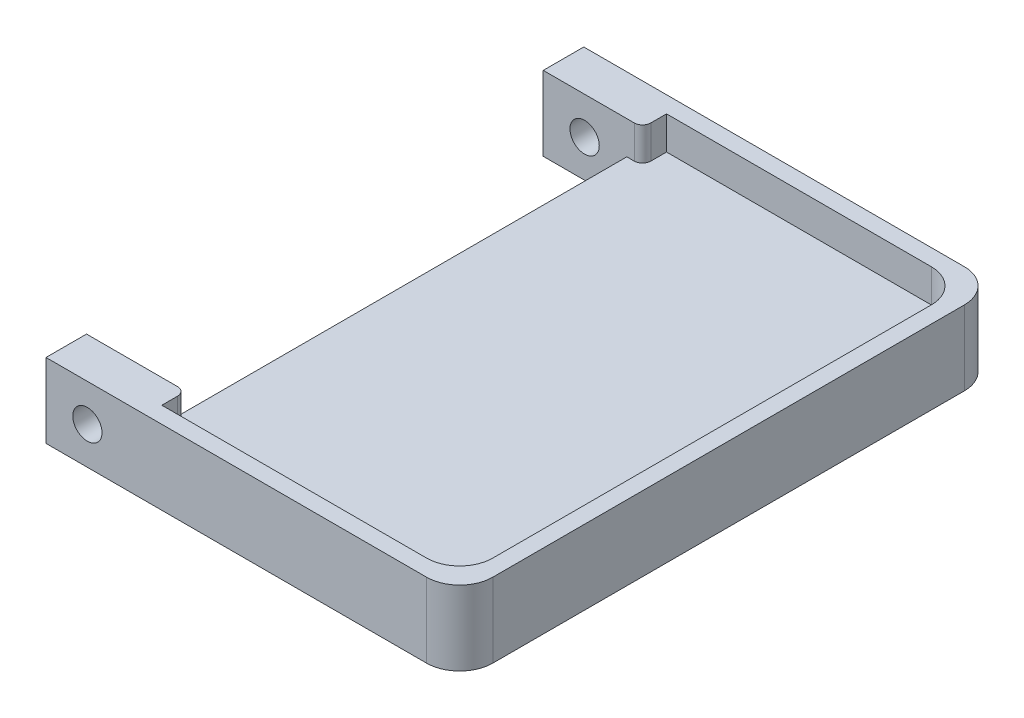
ISO-10303-21;
HEADER;
FILE_DESCRIPTION(('STEP AP214'),'2;1');
FILE_NAME('part.step','',(''),(''),'','','');
FILE_SCHEMA(('AUTOMOTIVE_DESIGN { 1 0 10303 214 1 1 1 1 }'));
ENDSEC;
DATA;
#1=APPLICATION_CONTEXT('core data for automotive mechanical design processes');
#2=APPLICATION_PROTOCOL_DEFINITION('international standard','automotive_design',2000,#1);
#3=PRODUCT_CONTEXT('',#1,'mechanical');
#4=PRODUCT('Part','Part','',(#3));
#5=PRODUCT_RELATED_PRODUCT_CATEGORY('part','',(#4));
#6=PRODUCT_DEFINITION_FORMATION('','',#4);
#7=PRODUCT_DEFINITION_CONTEXT('part definition',#1,'design');
#8=PRODUCT_DEFINITION('design','',#6,#7);
#9=PRODUCT_DEFINITION_SHAPE('','',#8);
#10=(LENGTH_UNIT() NAMED_UNIT(*) SI_UNIT(.MILLI.,.METRE.));
#11=(NAMED_UNIT(*) PLANE_ANGLE_UNIT() SI_UNIT($,.RADIAN.));
#12=(NAMED_UNIT(*) SI_UNIT($,.STERADIAN.) SOLID_ANGLE_UNIT());
#13=UNCERTAINTY_MEASURE_WITH_UNIT(LENGTH_MEASURE(1.E-05),#10,'distance_accuracy_value','');
#14=(GEOMETRIC_REPRESENTATION_CONTEXT(3) GLOBAL_UNCERTAINTY_ASSIGNED_CONTEXT((#13)) GLOBAL_UNIT_ASSIGNED_CONTEXT((#10,
#11,#12)) REPRESENTATION_CONTEXT('',''));
#15=CARTESIAN_POINT('',(0.,0.,0.));
#16=DIRECTION('',(0.,0.,1.));
#17=DIRECTION('',(1.,0.,0.));
#18=AXIS2_PLACEMENT_3D('',#15,#16,#17);
#19=CARTESIAN_POINT('',(0.,0.,6.223));
#20=DIRECTION('',(0.,0.,1.));
#21=DIRECTION('',(1.,0.,0.));
#22=AXIS2_PLACEMENT_3D('',#19,#20,#21);
#23=PLANE('',#22);
#24=CARTESIAN_POINT('',(6.35,5.715,6.223));
#25=DIRECTION('',(0.,0.,1.));
#26=DIRECTION('',(1.,0.,0.));
#27=AXIS2_PLACEMENT_3D('',#24,#25,#26);
#28=CIRCLE('',#27,2.2479);
#29=CARTESIAN_POINT('',(8.5979,5.715,6.223));
#30=VERTEX_POINT('',#29);
#31=EDGE_CURVE('E672',#30,#30,#28,.T.);
#32=ORIENTED_EDGE('',*,*,#31,.F.);
#33=EDGE_LOOP('',(#32));
#34=FACE_BOUND('',#33,.T.);
#35=DIRECTION('',(0.,-1.,0.));
#36=VECTOR('',#35,1.);
#37=CARTESIAN_POINT('',(12.827,6.35,6.223));
#38=LINE('',#37,#36);
#39=CARTESIAN_POINT('',(12.827,6.35,6.223));
#40=VERTEX_POINT('',#39);
#41=CARTESIAN_POINT('',(12.827,0.,6.223));
#42=VERTEX_POINT('',#41);
#43=EDGE_CURVE('E195',#40,#42,#38,.T.);
#44=ORIENTED_EDGE('',*,*,#43,.F.);
#45=DIRECTION('',(-1.,0.,0.));
#46=VECTOR('',#45,1.);
#47=CARTESIAN_POINT('',(13.335,6.35,6.223));
#48=LINE('',#47,#46);
#49=CARTESIAN_POINT('',(13.97,6.35,6.223));
#50=VERTEX_POINT('',#49);
#51=EDGE_CURVE('E222',#50,#40,#48,.T.);
#52=ORIENTED_EDGE('',*,*,#51,.F.);
#53=DIRECTION('',(0.,1.,0.));
#54=VECTOR('',#53,1.);
#55=CARTESIAN_POINT('',(13.97,11.43,6.223));
#56=LINE('',#55,#54);
#57=CARTESIAN_POINT('',(13.97,11.43,6.223));
#58=VERTEX_POINT('',#57);
#59=EDGE_CURVE('E369',#50,#58,#56,.T.);
#60=ORIENTED_EDGE('',*,*,#59,.T.);
#61=DIRECTION('',(1.,0.,0.));
#62=VECTOR('',#61,1.);
#63=CARTESIAN_POINT('',(0.,11.43,6.223));
#64=LINE('',#63,#62);
#65=CARTESIAN_POINT('',(0.,11.43,6.223));
#66=VERTEX_POINT('',#65);
#67=EDGE_CURVE('E214',#66,#58,#64,.T.);
#68=ORIENTED_EDGE('',*,*,#67,.F.);
#69=DIRECTION('',(0.,1.,0.));
#70=VECTOR('',#69,1.);
#71=CARTESIAN_POINT('',(0.,0.,6.223));
#72=LINE('',#71,#70);
#73=CARTESIAN_POINT('',(0.,0.,6.223));
#74=VERTEX_POINT('',#73);
#75=EDGE_CURVE('E207',#74,#66,#72,.T.);
#76=ORIENTED_EDGE('',*,*,#75,.F.);
#77=DIRECTION('',(1.,0.,0.));
#78=VECTOR('',#77,1.);
#79=CARTESIAN_POINT('',(0.,0.,6.223));
#80=LINE('',#79,#78);
#81=EDGE_CURVE('E189',#74,#42,#80,.T.);
#82=ORIENTED_EDGE('',*,*,#81,.T.);
#83=EDGE_LOOP('',(#44,#52,#60,#68,#76,#82));
#84=FACE_BOUND('',#83,.T.);
#85=ADVANCED_FACE('F45',(#34,#84),#23,.T.);
#86=CARTESIAN_POINT('',(0.,0.,76.327));
#87=DIRECTION('',(0.,0.,1.));
#88=DIRECTION('',(1.,0.,0.));
#89=AXIS2_PLACEMENT_3D('',#86,#87,#88);
#90=PLANE('',#89);
#91=CARTESIAN_POINT('',(6.35,5.715,76.327));
#92=DIRECTION('',(0.,0.,1.));
#93=DIRECTION('',(1.,0.,0.));
#94=AXIS2_PLACEMENT_3D('',#91,#92,#93);
#95=CIRCLE('',#94,2.2479);
#96=CARTESIAN_POINT('',(8.5979,5.715,76.327));
#97=VERTEX_POINT('',#96);
#98=EDGE_CURVE('E49',#97,#97,#95,.T.);
#99=ORIENTED_EDGE('',*,*,#98,.T.);
#100=EDGE_LOOP('',(#99));
#101=FACE_BOUND('',#100,.T.);
#102=DIRECTION('',(1.,0.,0.));
#103=VECTOR('',#102,1.);
#104=CARTESIAN_POINT('',(13.335,6.35,76.327));
#105=LINE('',#104,#103);
#106=CARTESIAN_POINT('',(12.827,6.35,76.327));
#107=VERTEX_POINT('',#106);
#108=CARTESIAN_POINT('',(13.97,6.35,76.327));
#109=VERTEX_POINT('',#108);
#110=EDGE_CURVE('E382',#107,#109,#105,.T.);
#111=ORIENTED_EDGE('',*,*,#110,.F.);
#112=DIRECTION('',(0.,1.,0.));
#113=VECTOR('',#112,1.);
#114=CARTESIAN_POINT('',(12.827,6.35,76.327));
#115=LINE('',#114,#113);
#116=CARTESIAN_POINT('',(12.827,0.,76.327));
#117=VERTEX_POINT('',#116);
#118=EDGE_CURVE('E194',#117,#107,#115,.T.);
#119=ORIENTED_EDGE('',*,*,#118,.F.);
#120=DIRECTION('',(1.,0.,0.));
#121=VECTOR('',#120,1.);
#122=CARTESIAN_POINT('',(0.,0.,76.327));
#123=LINE('',#122,#121);
#124=CARTESIAN_POINT('',(0.,0.,76.327));
#125=VERTEX_POINT('',#124);
#126=EDGE_CURVE('E192',#125,#117,#123,.T.);
#127=ORIENTED_EDGE('',*,*,#126,.F.);
#128=DIRECTION('',(0.,1.,0.));
#129=VECTOR('',#128,1.);
#130=CARTESIAN_POINT('',(0.,0.,76.327));
#131=LINE('',#130,#129);
#132=CARTESIAN_POINT('',(0.,11.43,76.327));
#133=VERTEX_POINT('',#132);
#134=EDGE_CURVE('E209',#125,#133,#131,.T.);
#135=ORIENTED_EDGE('',*,*,#134,.T.);
#136=DIRECTION('',(1.,0.,0.));
#137=VECTOR('',#136,1.);
#138=CARTESIAN_POINT('',(0.,11.43,76.327));
#139=LINE('',#138,#137);
#140=CARTESIAN_POINT('',(13.97,11.43,76.327));
#141=VERTEX_POINT('',#140);
#142=EDGE_CURVE('E218',#133,#141,#139,.T.);
#143=ORIENTED_EDGE('',*,*,#142,.T.);
#144=DIRECTION('',(0.,1.,0.));
#145=VECTOR('',#144,1.);
#146=CARTESIAN_POINT('',(13.97,0.,76.327));
#147=LINE('',#146,#145);
#148=EDGE_CURVE('E366',#141,#109,#147,.F.);
#149=ORIENTED_EDGE('',*,*,#148,.T.);
#150=EDGE_LOOP('',(#111,#119,#127,#135,#143,#149));
#151=FACE_BOUND('',#150,.T.);
#152=ADVANCED_FACE('F398',(#101,#151),#90,.F.);
#153=CARTESIAN_POINT('',(15.24,6.35,2.54));
#154=DIRECTION('',(-1.,0.,0.));
#155=DIRECTION('',(0.,0.,1.));
#156=AXIS2_PLACEMENT_3D('',#153,#154,#155);
#157=PLANE('',#156);
#158=DIRECTION('',(0.,0.,1.));
#159=VECTOR('',#158,1.);
#160=CARTESIAN_POINT('',(15.24,11.43,2.54));
#161=LINE('',#160,#159);
#162=CARTESIAN_POINT('',(15.24,11.43,2.54));
#163=VERTEX_POINT('',#162);
#164=CARTESIAN_POINT('',(15.24,11.43,4.953));
#165=VERTEX_POINT('',#164);
#166=EDGE_CURVE('E245',#163,#165,#161,.T.);
#167=ORIENTED_EDGE('',*,*,#166,.T.);
#168=DIRECTION('',(0.,1.,0.));
#169=VECTOR('',#168,1.);
#170=CARTESIAN_POINT('',(15.24,6.35,4.953));
#171=LINE('',#170,#169);
#172=CARTESIAN_POINT('',(15.24,6.35,4.953));
#173=VERTEX_POINT('',#172);
#174=EDGE_CURVE('E70',#165,#173,#171,.F.);
#175=ORIENTED_EDGE('',*,*,#174,.T.);
#176=DIRECTION('',(0.,0.,1.));
#177=VECTOR('',#176,1.);
#178=CARTESIAN_POINT('',(15.24,6.35,2.54));
#179=LINE('',#178,#177);
#180=CARTESIAN_POINT('',(15.24,6.35,2.54));
#181=VERTEX_POINT('',#180);
#182=EDGE_CURVE('E229',#181,#173,#179,.T.);
#183=ORIENTED_EDGE('',*,*,#182,.F.);
#184=DIRECTION('',(0.,1.,0.));
#185=VECTOR('',#184,1.);
#186=CARTESIAN_POINT('',(15.24,6.35,2.54));
#187=LINE('',#186,#185);
#188=EDGE_CURVE('E259',#181,#163,#187,.T.);
#189=ORIENTED_EDGE('',*,*,#188,.T.);
#190=EDGE_LOOP('',(#167,#175,#183,#189));
#191=FACE_BOUND('',#190,.T.);
#192=ADVANCED_FACE('F435',(#191),#157,.F.);
#193=CARTESIAN_POINT('',(0.,0.,82.55));
#194=DIRECTION('',(1.,0.,0.));
#195=DIRECTION('',(0.,0.,-1.));
#196=AXIS2_PLACEMENT_3D('',#193,#194,#195);
#197=PLANE('',#196);
#198=ORIENTED_EDGE('',*,*,#75,.T.);
#199=DIRECTION('',(0.,0.,-1.));
#200=VECTOR('',#199,1.);
#201=CARTESIAN_POINT('',(0.,11.43,82.55));
#202=LINE('',#201,#200);
#203=CARTESIAN_POINT('',(0.,11.43,0.));
#204=VERTEX_POINT('',#203);
#205=EDGE_CURVE('E279',#66,#204,#202,.T.);
#206=ORIENTED_EDGE('',*,*,#205,.T.);
#207=DIRECTION('',(0.,-1.,0.));
#208=VECTOR('',#207,1.);
#209=CARTESIAN_POINT('',(0.,0.,0.));
#210=LINE('',#209,#208);
#211=CARTESIAN_POINT('',(0.,0.,0.));
#212=VERTEX_POINT('',#211);
#213=EDGE_CURVE('E263',#204,#212,#210,.T.);
#214=ORIENTED_EDGE('',*,*,#213,.T.);
#215=DIRECTION('',(0.,0.,-1.));
#216=VECTOR('',#215,1.);
#217=CARTESIAN_POINT('',(0.,0.,82.55));
#218=LINE('',#217,#216);
#219=EDGE_CURVE('E300',#74,#212,#218,.T.);
#220=ORIENTED_EDGE('',*,*,#219,.F.);
#221=EDGE_LOOP('',(#198,#206,#214,#220));
#222=FACE_BOUND('',#221,.T.);
#223=ADVANCED_FACE('F473',(#222),#197,.F.);
#224=CARTESIAN_POINT('',(0.,0.,82.55));
#225=DIRECTION('',(0.,1.,0.));
#226=DIRECTION('',(0.,0.,1.));
#227=AXIS2_PLACEMENT_3D('',#224,#225,#226);
#228=PLANE('',#227);
#229=DIRECTION('',(1.,0.,0.));
#230=VECTOR('',#229,1.);
#231=CARTESIAN_POINT('',(0.,0.,0.));
#232=LINE('',#231,#230);
#233=CARTESIAN_POINT('',(58.42,0.,0.));
#234=VERTEX_POINT('',#233);
#235=EDGE_CURVE('E283',#212,#234,#232,.T.);
#236=ORIENTED_EDGE('',*,*,#235,.T.);
#237=CARTESIAN_POINT('',(58.42,0.,5.08));
#238=DIRECTION('',(0.,1.,0.));
#239=DIRECTION('',(0.,0.,1.));
#240=AXIS2_PLACEMENT_3D('',#237,#238,#239);
#241=CIRCLE('',#240,5.08);
#242=CARTESIAN_POINT('',(63.5,0.,5.08));
#243=VERTEX_POINT('',#242);
#244=EDGE_CURVE('E349',#234,#243,#241,.F.);
#245=ORIENTED_EDGE('',*,*,#244,.T.);
#246=DIRECTION('',(0.,0.,-1.));
#247=VECTOR('',#246,1.);
#248=CARTESIAN_POINT('',(63.5,0.,82.55));
#249=LINE('',#248,#247);
#250=CARTESIAN_POINT('',(63.5,0.,77.47));
#251=VERTEX_POINT('',#250);
#252=EDGE_CURVE('E296',#251,#243,#249,.T.);
#253=ORIENTED_EDGE('',*,*,#252,.F.);
#254=CARTESIAN_POINT('',(58.42,0.,77.47));
#255=DIRECTION('',(0.,1.,0.));
#256=DIRECTION('',(0.,0.,1.));
#257=AXIS2_PLACEMENT_3D('',#254,#255,#256);
#258=CIRCLE('',#257,5.08);
#259=CARTESIAN_POINT('',(58.42,0.,82.55));
#260=VERTEX_POINT('',#259);
#261=EDGE_CURVE('E346',#251,#260,#258,.F.);
#262=ORIENTED_EDGE('',*,*,#261,.T.);
#263=DIRECTION('',(1.,0.,0.));
#264=VECTOR('',#263,1.);
#265=CARTESIAN_POINT('',(0.,0.,82.55));
#266=LINE('',#265,#264);
#267=CARTESIAN_POINT('',(0.,0.,82.55));
#268=VERTEX_POINT('',#267);
#269=EDGE_CURVE('E271',#268,#260,#266,.T.);
#270=ORIENTED_EDGE('',*,*,#269,.F.);
#271=EDGE_CURVE('E301',#268,#125,#218,.T.);
#272=ORIENTED_EDGE('',*,*,#271,.T.);
#273=ORIENTED_EDGE('',*,*,#126,.T.);
#274=DIRECTION('',(0.,0.,1.));
#275=VECTOR('',#274,1.);
#276=CARTESIAN_POINT('',(12.827,0.,6.223));
#277=LINE('',#276,#275);
#278=EDGE_CURVE('E62',#42,#117,#277,.T.);
#279=ORIENTED_EDGE('',*,*,#278,.F.);
#280=ORIENTED_EDGE('',*,*,#81,.F.);
#281=ORIENTED_EDGE('',*,*,#219,.T.);
#282=EDGE_LOOP('',(#236,#245,#253,#262,#270,#272,#273,#279,#280,#281));
#283=FACE_BOUND('',#282,.T.);
#284=ADVANCED_FACE('F187',(#283),#228,.F.);
#285=CARTESIAN_POINT('',(0.,11.43,82.55));
#286=DIRECTION('',(0.,-1.,0.));
#287=DIRECTION('',(0.,0.,-1.));
#288=AXIS2_PLACEMENT_3D('',#285,#286,#287);
#289=PLANE('',#288);
#290=CARTESIAN_POINT('',(15.24,11.43,77.597));
#291=VERTEX_POINT('',#290);
#292=CARTESIAN_POINT('',(15.24,11.43,80.01));
#293=VERTEX_POINT('',#292);
#294=EDGE_CURVE('E227',#291,#293,#161,.T.);
#295=ORIENTED_EDGE('',*,*,#294,.F.);
#296=CARTESIAN_POINT('',(13.97,11.43,77.597));
#297=DIRECTION('',(0.,-1.,0.));
#298=DIRECTION('',(0.,0.,-1.));
#299=AXIS2_PLACEMENT_3D('',#296,#297,#298);
#300=CIRCLE('',#299,1.27);
#301=EDGE_CURVE('E363',#291,#141,#300,.F.);
#302=ORIENTED_EDGE('',*,*,#301,.T.);
#303=ORIENTED_EDGE('',*,*,#142,.F.);
#304=CARTESIAN_POINT('',(0.,11.43,82.55));
#305=VERTEX_POINT('',#304);
#306=EDGE_CURVE('E288',#305,#133,#202,.T.);
#307=ORIENTED_EDGE('',*,*,#306,.F.);
#308=DIRECTION('',(-1.,0.,0.));
#309=VECTOR('',#308,1.);
#310=CARTESIAN_POINT('',(0.,11.43,82.55));
#311=LINE('',#310,#309);
#312=CARTESIAN_POINT('',(58.42,11.43,82.55));
#313=VERTEX_POINT('',#312);
#314=EDGE_CURVE('E276',#313,#305,#311,.T.);
#315=ORIENTED_EDGE('',*,*,#314,.F.);
#316=CARTESIAN_POINT('',(58.42,11.43,77.47));
#317=DIRECTION('',(0.,-1.,0.));
#318=DIRECTION('',(0.,0.,-1.));
#319=AXIS2_PLACEMENT_3D('',#316,#317,#318);
#320=CIRCLE('',#319,5.08);
#321=CARTESIAN_POINT('',(63.5,11.43,77.47));
#322=VERTEX_POINT('',#321);
#323=EDGE_CURVE('E337',#313,#322,#320,.F.);
#324=ORIENTED_EDGE('',*,*,#323,.T.);
#325=DIRECTION('',(0.,0.,-1.));
#326=VECTOR('',#325,1.);
#327=CARTESIAN_POINT('',(63.5,11.43,82.55));
#328=LINE('',#327,#326);
#329=CARTESIAN_POINT('',(63.5,11.43,5.08));
#330=VERTEX_POINT('',#329);
#331=EDGE_CURVE('E292',#322,#330,#328,.T.);
#332=ORIENTED_EDGE('',*,*,#331,.T.);
#333=CARTESIAN_POINT('',(58.42,11.43,5.08));
#334=DIRECTION('',(0.,-1.,0.));
#335=DIRECTION('',(0.,0.,-1.));
#336=AXIS2_PLACEMENT_3D('',#333,#334,#335);
#337=CIRCLE('',#336,5.08);
#338=CARTESIAN_POINT('',(58.42,11.43,0.));
#339=VERTEX_POINT('',#338);
#340=EDGE_CURVE('E340',#330,#339,#337,.F.);
#341=ORIENTED_EDGE('',*,*,#340,.T.);
#342=DIRECTION('',(-1.,0.,0.));
#343=VECTOR('',#342,1.);
#344=CARTESIAN_POINT('',(0.,11.43,0.));
#345=LINE('',#344,#343);
#346=EDGE_CURVE('E272',#339,#204,#345,.T.);
#347=ORIENTED_EDGE('',*,*,#346,.T.);
#348=ORIENTED_EDGE('',*,*,#205,.F.);
#349=ORIENTED_EDGE('',*,*,#67,.T.);
#350=CARTESIAN_POINT('',(13.97,11.43,4.953));
#351=DIRECTION('',(0.,-1.,0.));
#352=DIRECTION('',(0.,0.,-1.));
#353=AXIS2_PLACEMENT_3D('',#350,#351,#352);
#354=CIRCLE('',#353,1.27);
#355=EDGE_CURVE('E360',#58,#165,#354,.F.);
#356=ORIENTED_EDGE('',*,*,#355,.T.);
#357=ORIENTED_EDGE('',*,*,#166,.F.);
#358=DIRECTION('',(-1.,0.,0.));
#359=VECTOR('',#358,1.);
#360=CARTESIAN_POINT('',(15.24,11.43,2.54));
#361=LINE('',#360,#359);
#362=CARTESIAN_POINT('',(55.88,11.43,2.54));
#363=VERTEX_POINT('',#362);
#364=EDGE_CURVE('E256',#363,#163,#361,.T.);
#365=ORIENTED_EDGE('',*,*,#364,.F.);
#366=CARTESIAN_POINT('',(55.88,11.43,7.62));
#367=DIRECTION('',(0.,-1.,0.));
#368=DIRECTION('',(0.,0.,-1.));
#369=AXIS2_PLACEMENT_3D('',#366,#367,#368);
#370=CIRCLE('',#369,5.08);
#371=CARTESIAN_POINT('',(60.96,11.43,7.62));
#372=VERTEX_POINT('',#371);
#373=EDGE_CURVE('E327',#363,#372,#370,.T.);
#374=ORIENTED_EDGE('',*,*,#373,.T.);
#375=DIRECTION('',(0.,0.,-1.));
#376=VECTOR('',#375,1.);
#377=CARTESIAN_POINT('',(60.96,11.43,2.54));
#378=LINE('',#377,#376);
#379=CARTESIAN_POINT('',(60.96,11.43,74.93));
#380=VERTEX_POINT('',#379);
#381=EDGE_CURVE('E252',#380,#372,#378,.T.);
#382=ORIENTED_EDGE('',*,*,#381,.F.);
#383=CARTESIAN_POINT('',(55.88,11.43,74.93));
#384=DIRECTION('',(0.,-1.,0.));
#385=DIRECTION('',(0.,0.,-1.));
#386=AXIS2_PLACEMENT_3D('',#383,#384,#385);
#387=CIRCLE('',#386,5.08);
#388=CARTESIAN_POINT('',(55.88,11.43,80.01));
#389=VERTEX_POINT('',#388);
#390=EDGE_CURVE('E324',#380,#389,#387,.T.);
#391=ORIENTED_EDGE('',*,*,#390,.T.);
#392=DIRECTION('',(1.,0.,0.));
#393=VECTOR('',#392,1.);
#394=CARTESIAN_POINT('',(15.24,11.43,80.01));
#395=LINE('',#394,#393);
#396=EDGE_CURVE('E248',#293,#389,#395,.T.);
#397=ORIENTED_EDGE('',*,*,#396,.F.);
#398=EDGE_LOOP('',(#295,#302,#303,#307,#315,#324,#332,#341,#347,#348,#349,#356,#357,#365,#374,
#382,#391,#397));
#399=FACE_BOUND('',#398,.T.);
#400=ADVANCED_FACE('F394',(#399),#289,.F.);
#401=ORIENTED_EDGE('',*,*,#306,.T.);
#402=ORIENTED_EDGE('',*,*,#134,.F.);
#403=ORIENTED_EDGE('',*,*,#271,.F.);
#404=DIRECTION('',(0.,-1.,0.));
#405=VECTOR('',#404,1.);
#406=CARTESIAN_POINT('',(0.,0.,82.55));
#407=LINE('',#406,#405);
#408=EDGE_CURVE('E267',#305,#268,#407,.T.);
#409=ORIENTED_EDGE('',*,*,#408,.F.);
#410=EDGE_LOOP('',(#401,#402,#403,#409));
#411=FACE_BOUND('',#410,.T.);
#412=ADVANCED_FACE('F402',(#411),#197,.F.);
#413=CARTESIAN_POINT('',(63.5,0.,82.55));
#414=DIRECTION('',(-1.,0.,0.));
#415=DIRECTION('',(0.,0.,1.));
#416=AXIS2_PLACEMENT_3D('',#413,#414,#415);
#417=PLANE('',#416);
#418=ORIENTED_EDGE('',*,*,#252,.T.);
#419=DIRECTION('',(0.,1.,0.));
#420=VECTOR('',#419,1.);
#421=CARTESIAN_POINT('',(63.5,11.43,5.08));
#422=LINE('',#421,#420);
#423=EDGE_CURVE('E333',#243,#330,#422,.T.);
#424=ORIENTED_EDGE('',*,*,#423,.T.);
#425=ORIENTED_EDGE('',*,*,#331,.F.);
#426=DIRECTION('',(0.,1.,0.));
#427=VECTOR('',#426,1.);
#428=CARTESIAN_POINT('',(63.5,0.,77.47));
#429=LINE('',#428,#427);
#430=EDGE_CURVE('E330',#322,#251,#429,.F.);
#431=ORIENTED_EDGE('',*,*,#430,.T.);
#432=EDGE_LOOP('',(#418,#424,#425,#431));
#433=FACE_BOUND('',#432,.T.);
#434=ADVANCED_FACE('F414',(#433),#417,.F.);
#435=CARTESIAN_POINT('',(0.,0.,82.55));
#436=DIRECTION('',(0.,0.,-1.));
#437=DIRECTION('',(-1.,0.,0.));
#438=AXIS2_PLACEMENT_3D('',#435,#436,#437);
#439=PLANE('',#438);
#440=CARTESIAN_POINT('',(6.35,5.715,82.55));
#441=DIRECTION('',(0.,0.,1.));
#442=DIRECTION('',(1.,0.,0.));
#443=AXIS2_PLACEMENT_3D('',#440,#441,#442);
#444=CIRCLE('',#443,2.2479);
#445=CARTESIAN_POINT('',(8.5979,5.715,82.55));
#446=VERTEX_POINT('',#445);
#447=EDGE_CURVE('E677',#446,#446,#444,.T.);
#448=ORIENTED_EDGE('',*,*,#447,.F.);
#449=EDGE_LOOP('',(#448));
#450=FACE_BOUND('',#449,.T.);
#451=ORIENTED_EDGE('',*,*,#269,.T.);
#452=DIRECTION('',(0.,1.,0.));
#453=VECTOR('',#452,1.);
#454=CARTESIAN_POINT('',(58.42,0.,82.55));
#455=LINE('',#454,#453);
#456=EDGE_CURVE('E352',#260,#313,#455,.T.);
#457=ORIENTED_EDGE('',*,*,#456,.T.);
#458=ORIENTED_EDGE('',*,*,#314,.T.);
#459=ORIENTED_EDGE('',*,*,#408,.T.);
#460=EDGE_LOOP('',(#451,#457,#458,#459));
#461=FACE_BOUND('',#460,.T.);
#462=ADVANCED_FACE('F408',(#450,#461),#439,.F.);
#463=CARTESIAN_POINT('',(0.,0.,0.));
#464=DIRECTION('',(0.,0.,-1.));
#465=DIRECTION('',(-1.,0.,0.));
#466=AXIS2_PLACEMENT_3D('',#463,#464,#465);
#467=PLANE('',#466);
#468=CARTESIAN_POINT('',(6.35,5.715,0.));
#469=DIRECTION('',(0.,0.,1.));
#470=DIRECTION('',(1.,0.,0.));
#471=AXIS2_PLACEMENT_3D('',#468,#469,#470);
#472=CIRCLE('',#471,2.2479);
#473=CARTESIAN_POINT('',(8.5979,5.715,0.));
#474=VERTEX_POINT('',#473);
#475=EDGE_CURVE('E675',#474,#474,#472,.T.);
#476=ORIENTED_EDGE('',*,*,#475,.T.);
#477=EDGE_LOOP('',(#476));
#478=FACE_BOUND('',#477,.T.);
#479=ORIENTED_EDGE('',*,*,#346,.F.);
#480=DIRECTION('',(0.,1.,0.));
#481=VECTOR('',#480,1.);
#482=CARTESIAN_POINT('',(58.42,0.,0.));
#483=LINE('',#482,#481);
#484=EDGE_CURVE('E343',#339,#234,#483,.F.);
#485=ORIENTED_EDGE('',*,*,#484,.T.);
#486=ORIENTED_EDGE('',*,*,#235,.F.);
#487=ORIENTED_EDGE('',*,*,#213,.F.);
#488=EDGE_LOOP('',(#479,#485,#486,#487));
#489=FACE_BOUND('',#488,.T.);
#490=ADVANCED_FACE('F460',(#478,#489),#467,.T.);
#491=CARTESIAN_POINT('',(15.24,6.35,77.597));
#492=VERTEX_POINT('',#491);
#493=CARTESIAN_POINT('',(15.24,6.35,80.01));
#494=VERTEX_POINT('',#493);
#495=EDGE_CURVE('E233',#492,#494,#179,.T.);
#496=ORIENTED_EDGE('',*,*,#495,.F.);
#497=DIRECTION('',(0.,1.,0.));
#498=VECTOR('',#497,1.);
#499=CARTESIAN_POINT('',(15.24,6.35,77.597));
#500=LINE('',#499,#498);
#501=EDGE_CURVE('E356',#492,#291,#500,.T.);
#502=ORIENTED_EDGE('',*,*,#501,.T.);
#503=ORIENTED_EDGE('',*,*,#294,.T.);
#504=DIRECTION('',(0.,1.,0.));
#505=VECTOR('',#504,1.);
#506=CARTESIAN_POINT('',(15.24,6.35,80.01));
#507=LINE('',#506,#505);
#508=EDGE_CURVE('E244',#494,#293,#507,.T.);
#509=ORIENTED_EDGE('',*,*,#508,.F.);
#510=EDGE_LOOP('',(#496,#502,#503,#509));
#511=FACE_BOUND('',#510,.T.);
#512=ADVANCED_FACE('F387',(#511),#157,.F.);
#513=CARTESIAN_POINT('',(15.24,6.35,2.54));
#514=DIRECTION('',(0.,0.,-1.));
#515=DIRECTION('',(-1.,0.,0.));
#516=AXIS2_PLACEMENT_3D('',#513,#514,#515);
#517=PLANE('',#516);
#518=DIRECTION('',(-1.,0.,0.));
#519=VECTOR('',#518,1.);
#520=CARTESIAN_POINT('',(15.24,6.35,2.54));
#521=LINE('',#520,#519);
#522=CARTESIAN_POINT('',(55.88,6.35,2.54));
#523=VERTEX_POINT('',#522);
#524=EDGE_CURVE('E241',#523,#181,#521,.T.);
#525=ORIENTED_EDGE('',*,*,#524,.F.);
#526=DIRECTION('',(0.,1.,0.));
#527=VECTOR('',#526,1.);
#528=CARTESIAN_POINT('',(55.88,11.43,2.54));
#529=LINE('',#528,#527);
#530=EDGE_CURVE('E320',#523,#363,#529,.T.);
#531=ORIENTED_EDGE('',*,*,#530,.T.);
#532=ORIENTED_EDGE('',*,*,#364,.T.);
#533=ORIENTED_EDGE('',*,*,#188,.F.);
#534=EDGE_LOOP('',(#525,#531,#532,#533));
#535=FACE_BOUND('',#534,.T.);
#536=ADVANCED_FACE('F447',(#535),#517,.F.);
#537=CARTESIAN_POINT('',(60.96,6.35,2.54));
#538=DIRECTION('',(1.,0.,0.));
#539=DIRECTION('',(0.,0.,-1.));
#540=AXIS2_PLACEMENT_3D('',#537,#538,#539);
#541=PLANE('',#540);
#542=DIRECTION('',(0.,0.,-1.));
#543=VECTOR('',#542,1.);
#544=CARTESIAN_POINT('',(60.96,6.35,2.54));
#545=LINE('',#544,#543);
#546=CARTESIAN_POINT('',(60.96,6.35,74.93));
#547=VERTEX_POINT('',#546);
#548=CARTESIAN_POINT('',(60.96,6.35,7.62));
#549=VERTEX_POINT('',#548);
#550=EDGE_CURVE('E237',#547,#549,#545,.T.);
#551=ORIENTED_EDGE('',*,*,#550,.F.);
#552=DIRECTION('',(0.,1.,0.));
#553=VECTOR('',#552,1.);
#554=CARTESIAN_POINT('',(60.96,11.43,74.93));
#555=LINE('',#554,#553);
#556=EDGE_CURVE('E307',#547,#380,#555,.T.);
#557=ORIENTED_EDGE('',*,*,#556,.T.);
#558=ORIENTED_EDGE('',*,*,#381,.T.);
#559=DIRECTION('',(0.,1.,0.));
#560=VECTOR('',#559,1.);
#561=CARTESIAN_POINT('',(60.96,6.35,7.62));
#562=LINE('',#561,#560);
#563=EDGE_CURVE('E304',#372,#549,#562,.F.);
#564=ORIENTED_EDGE('',*,*,#563,.T.);
#565=EDGE_LOOP('',(#551,#557,#558,#564));
#566=FACE_BOUND('',#565,.T.);
#567=ADVANCED_FACE('F450',(#566),#541,.F.);
#568=CARTESIAN_POINT('',(15.24,6.35,80.01));
#569=DIRECTION('',(0.,0.,1.));
#570=DIRECTION('',(1.,0.,0.));
#571=AXIS2_PLACEMENT_3D('',#568,#569,#570);
#572=PLANE('',#571);
#573=ORIENTED_EDGE('',*,*,#396,.T.);
#574=DIRECTION('',(0.,1.,0.));
#575=VECTOR('',#574,1.);
#576=CARTESIAN_POINT('',(55.88,6.35,80.01));
#577=LINE('',#576,#575);
#578=CARTESIAN_POINT('',(55.88,6.35,80.01));
#579=VERTEX_POINT('',#578);
#580=EDGE_CURVE('E311',#389,#579,#577,.F.);
#581=ORIENTED_EDGE('',*,*,#580,.T.);
#582=DIRECTION('',(1.,0.,0.));
#583=VECTOR('',#582,1.);
#584=CARTESIAN_POINT('',(15.24,6.35,80.01));
#585=LINE('',#584,#583);
#586=EDGE_CURVE('E232',#494,#579,#585,.T.);
#587=ORIENTED_EDGE('',*,*,#586,.F.);
#588=ORIENTED_EDGE('',*,*,#508,.T.);
#589=EDGE_LOOP('',(#573,#581,#587,#588));
#590=FACE_BOUND('',#589,.T.);
#591=ADVANCED_FACE('F446',(#590),#572,.F.);
#592=CARTESIAN_POINT('',(0.,6.35,0.));
#593=DIRECTION('',(0.,1.,0.));
#594=DIRECTION('',(0.,0.,1.));
#595=AXIS2_PLACEMENT_3D('',#592,#593,#594);
#596=PLANE('',#595);
#597=ORIENTED_EDGE('',*,*,#586,.T.);
#598=CARTESIAN_POINT('',(55.88,6.35,74.93));
#599=DIRECTION('',(0.,1.,0.));
#600=DIRECTION('',(0.,0.,1.));
#601=AXIS2_PLACEMENT_3D('',#598,#599,#600);
#602=CIRCLE('',#601,5.08);
#603=EDGE_CURVE('E317',#579,#547,#602,.T.);
#604=ORIENTED_EDGE('',*,*,#603,.T.);
#605=ORIENTED_EDGE('',*,*,#550,.T.);
#606=CARTESIAN_POINT('',(55.88,6.35,7.62));
#607=DIRECTION('',(0.,1.,0.));
#608=DIRECTION('',(0.,0.,1.));
#609=AXIS2_PLACEMENT_3D('',#606,#607,#608);
#610=CIRCLE('',#609,5.08);
#611=EDGE_CURVE('E314',#549,#523,#610,.T.);
#612=ORIENTED_EDGE('',*,*,#611,.T.);
#613=ORIENTED_EDGE('',*,*,#524,.T.);
#614=ORIENTED_EDGE('',*,*,#182,.T.);
#615=CARTESIAN_POINT('',(13.97,6.35,4.953));
#616=DIRECTION('',(0.,1.,0.));
#617=DIRECTION('',(0.,0.,1.));
#618=AXIS2_PLACEMENT_3D('',#615,#616,#617);
#619=CIRCLE('',#618,1.27);
#620=EDGE_CURVE('E11',#173,#50,#619,.F.);
#621=ORIENTED_EDGE('',*,*,#620,.T.);
#622=ORIENTED_EDGE('',*,*,#51,.T.);
#623=DIRECTION('',(0.,0.,-1.));
#624=VECTOR('',#623,1.);
#625=CARTESIAN_POINT('',(12.827,6.35,6.223));
#626=LINE('',#625,#624);
#627=EDGE_CURVE('E201',#107,#40,#626,.T.);
#628=ORIENTED_EDGE('',*,*,#627,.F.);
#629=ORIENTED_EDGE('',*,*,#110,.T.);
#630=CARTESIAN_POINT('',(13.97,6.35,77.597));
#631=DIRECTION('',(0.,1.,0.));
#632=DIRECTION('',(0.,0.,1.));
#633=AXIS2_PLACEMENT_3D('',#630,#631,#632);
#634=CIRCLE('',#633,1.27);
#635=EDGE_CURVE('E55',#109,#492,#634,.F.);
#636=ORIENTED_EDGE('',*,*,#635,.T.);
#637=ORIENTED_EDGE('',*,*,#495,.T.);
#638=EDGE_LOOP('',(#597,#604,#605,#612,#613,#614,#621,#622,#628,#629,#636,#637));
#639=FACE_BOUND('',#638,.T.);
#640=ADVANCED_FACE('F380',(#639),#596,.T.);
#641=CARTESIAN_POINT('',(55.88,6.35,74.93));
#642=DIRECTION('',(0.,-1.,0.));
#643=DIRECTION('',(0.,0.,-1.));
#644=AXIS2_PLACEMENT_3D('',#641,#642,#643);
#645=CYLINDRICAL_SURFACE('',#644,5.08);
#646=ORIENTED_EDGE('',*,*,#603,.F.);
#647=ORIENTED_EDGE('',*,*,#580,.F.);
#648=ORIENTED_EDGE('',*,*,#390,.F.);
#649=ORIENTED_EDGE('',*,*,#556,.F.);
#650=EDGE_LOOP('',(#646,#647,#648,#649));
#651=FACE_BOUND('',#650,.T.);
#652=ADVANCED_FACE('F445',(#651),#645,.F.);
#653=CARTESIAN_POINT('',(55.88,6.35,7.62));
#654=DIRECTION('',(0.,-1.,0.));
#655=DIRECTION('',(0.,0.,-1.));
#656=AXIS2_PLACEMENT_3D('',#653,#654,#655);
#657=CYLINDRICAL_SURFACE('',#656,5.08);
#658=ORIENTED_EDGE('',*,*,#611,.F.);
#659=ORIENTED_EDGE('',*,*,#563,.F.);
#660=ORIENTED_EDGE('',*,*,#373,.F.);
#661=ORIENTED_EDGE('',*,*,#530,.F.);
#662=EDGE_LOOP('',(#658,#659,#660,#661));
#663=FACE_BOUND('',#662,.T.);
#664=ADVANCED_FACE('F425',(#663),#657,.F.);
#665=CARTESIAN_POINT('',(58.42,0.,5.08));
#666=DIRECTION('',(0.,-1.,0.));
#667=DIRECTION('',(0.,0.,-1.));
#668=AXIS2_PLACEMENT_3D('',#665,#666,#667);
#669=CYLINDRICAL_SURFACE('',#668,5.08);
#670=ORIENTED_EDGE('',*,*,#244,.F.);
#671=ORIENTED_EDGE('',*,*,#484,.F.);
#672=ORIENTED_EDGE('',*,*,#340,.F.);
#673=ORIENTED_EDGE('',*,*,#423,.F.);
#674=EDGE_LOOP('',(#670,#671,#672,#673));
#675=FACE_BOUND('',#674,.T.);
#676=ADVANCED_FACE('F418',(#675),#669,.T.);
#677=CARTESIAN_POINT('',(58.42,0.,77.47));
#678=DIRECTION('',(0.,1.,0.));
#679=DIRECTION('',(0.,0.,1.));
#680=AXIS2_PLACEMENT_3D('',#677,#678,#679);
#681=CYLINDRICAL_SURFACE('',#680,5.08);
#682=ORIENTED_EDGE('',*,*,#261,.F.);
#683=ORIENTED_EDGE('',*,*,#430,.F.);
#684=ORIENTED_EDGE('',*,*,#323,.F.);
#685=ORIENTED_EDGE('',*,*,#456,.F.);
#686=EDGE_LOOP('',(#682,#683,#684,#685));
#687=FACE_BOUND('',#686,.T.);
#688=ADVANCED_FACE('F416',(#687),#681,.T.);
#689=CARTESIAN_POINT('',(13.97,6.35,77.597));
#690=DIRECTION('',(0.,1.,0.));
#691=DIRECTION('',(0.,0.,1.));
#692=AXIS2_PLACEMENT_3D('',#689,#690,#691);
#693=CYLINDRICAL_SURFACE('',#692,1.27);
#694=ORIENTED_EDGE('',*,*,#635,.F.);
#695=ORIENTED_EDGE('',*,*,#148,.F.);
#696=ORIENTED_EDGE('',*,*,#301,.F.);
#697=ORIENTED_EDGE('',*,*,#501,.F.);
#698=EDGE_LOOP('',(#694,#695,#696,#697));
#699=FACE_BOUND('',#698,.T.);
#700=ADVANCED_FACE('F391',(#699),#693,.T.);
#701=CARTESIAN_POINT('',(13.97,0.,4.953));
#702=DIRECTION('',(0.,-1.,0.));
#703=DIRECTION('',(0.,0.,-1.));
#704=AXIS2_PLACEMENT_3D('',#701,#702,#703);
#705=CYLINDRICAL_SURFACE('',#704,1.27);
#706=ORIENTED_EDGE('',*,*,#620,.F.);
#707=ORIENTED_EDGE('',*,*,#174,.F.);
#708=ORIENTED_EDGE('',*,*,#355,.F.);
#709=ORIENTED_EDGE('',*,*,#59,.F.);
#710=EDGE_LOOP('',(#706,#707,#708,#709));
#711=FACE_BOUND('',#710,.T.);
#712=ADVANCED_FACE('F47',(#711),#705,.T.);
#713=CARTESIAN_POINT('',(6.35,5.715,0.));
#714=DIRECTION('',(0.,0.,1.));
#715=DIRECTION('',(1.,0.,0.));
#716=AXIS2_PLACEMENT_3D('',#713,#714,#715);
#717=CYLINDRICAL_SURFACE('',#716,2.2479);
#718=ORIENTED_EDGE('',*,*,#447,.T.);
#719=EDGE_LOOP('',(#718));
#720=FACE_BOUND('',#719,.T.);
#721=ORIENTED_EDGE('',*,*,#98,.F.);
#722=EDGE_LOOP('',(#721));
#723=FACE_BOUND('',#722,.T.);
#724=ADVANCED_FACE('F540',(#720,#723),#717,.F.);
#725=ORIENTED_EDGE('',*,*,#31,.T.);
#726=EDGE_LOOP('',(#725));
#727=FACE_BOUND('',#726,.T.);
#728=ORIENTED_EDGE('',*,*,#475,.F.);
#729=EDGE_LOOP('',(#728));
#730=FACE_BOUND('',#729,.T.);
#731=ADVANCED_FACE('F440',(#727,#730),#717,.F.);
#732=CARTESIAN_POINT('',(12.827,0.,0.));
#733=DIRECTION('',(-1.,0.,0.));
#734=DIRECTION('',(0.,0.,1.));
#735=AXIS2_PLACEMENT_3D('',#732,#733,#734);
#736=PLANE('',#735);
#737=ORIENTED_EDGE('',*,*,#43,.T.);
#738=ORIENTED_EDGE('',*,*,#278,.T.);
#739=ORIENTED_EDGE('',*,*,#118,.T.);
#740=ORIENTED_EDGE('',*,*,#627,.T.);
#741=EDGE_LOOP('',(#737,#738,#739,#740));
#742=FACE_BOUND('',#741,.T.);
#743=ADVANCED_FACE('F199',(#742),#736,.T.);
#744=CLOSED_SHELL('',(#85,#152,#192,#223,#284,#400,#412,#434,#462,#490,#512,#536,#567,#591,#640,
#652,#664,#676,#688,#700,#712,#724,#731,#743));
#745=MANIFOLD_SOLID_BREP('B2',#744);
#746=ADVANCED_BREP_SHAPE_REPRESENTATION('',(#18,#745),#14);
#747=SHAPE_DEFINITION_REPRESENTATION(#9,#746);
ENDSEC;
END-ISO-10303-21;
